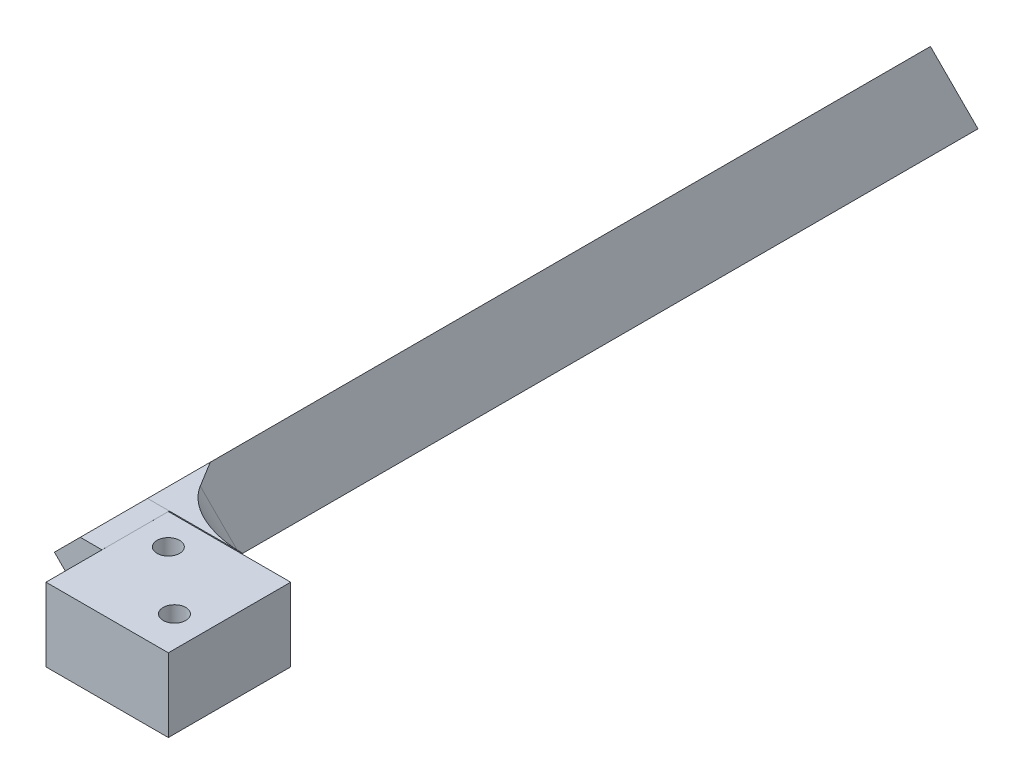
ISO-10303-21;
HEADER;
FILE_DESCRIPTION(('STEP AP214'),'2;1');
FILE_NAME('part.step','',(''),(''),'','','');
FILE_SCHEMA(('AUTOMOTIVE_DESIGN { 1 0 10303 214 1 1 1 1 }'));
ENDSEC;
DATA;
#1=APPLICATION_CONTEXT('core data for automotive mechanical design processes');
#2=APPLICATION_PROTOCOL_DEFINITION('international standard','automotive_design',2000,#1);
#3=PRODUCT_CONTEXT('',#1,'mechanical');
#4=PRODUCT('Part','Part','',(#3));
#5=PRODUCT_RELATED_PRODUCT_CATEGORY('part','',(#4));
#6=PRODUCT_DEFINITION_FORMATION('','',#4);
#7=PRODUCT_DEFINITION_CONTEXT('part definition',#1,'design');
#8=PRODUCT_DEFINITION('design','',#6,#7);
#9=PRODUCT_DEFINITION_SHAPE('','',#8);
#10=(LENGTH_UNIT() NAMED_UNIT(*) SI_UNIT(.MILLI.,.METRE.));
#11=(NAMED_UNIT(*) PLANE_ANGLE_UNIT() SI_UNIT($,.RADIAN.));
#12=(NAMED_UNIT(*) SI_UNIT($,.STERADIAN.) SOLID_ANGLE_UNIT());
#13=UNCERTAINTY_MEASURE_WITH_UNIT(LENGTH_MEASURE(1.E-05),#10,'distance_accuracy_value','');
#14=(GEOMETRIC_REPRESENTATION_CONTEXT(3) GLOBAL_UNCERTAINTY_ASSIGNED_CONTEXT((#13)) GLOBAL_UNIT_ASSIGNED_CONTEXT((#10,
#11,#12)) REPRESENTATION_CONTEXT('',''));
#15=CARTESIAN_POINT('',(0.,0.,0.));
#16=DIRECTION('',(0.,0.,1.));
#17=DIRECTION('',(1.,0.,0.));
#18=AXIS2_PLACEMENT_3D('',#15,#16,#17);
#19=CARTESIAN_POINT('',(-54.8596687094186,-214.742435052336,-20.1546564528659));
#20=DIRECTION('',(0.,0.,-1.));
#21=DIRECTION('',(1.,0.,0.));
#22=AXIS2_PLACEMENT_3D('',#19,#20,#21);
#23=PLANE('',#22);
#24=DIRECTION('',(-0.707106781186552,-0.707106781186543,0.));
#25=VECTOR('',#24,1.);
#26=CARTESIAN_POINT('',(-54.8596687094186,-214.742435052336,-20.1546564528659));
#27=LINE('',#26,#25);
#28=CARTESIAN_POINT('',(-50.6370361956894,-210.519802538606,-20.1546564528659));
#29=VERTEX_POINT('',#28);
#30=CARTESIAN_POINT('',(-50.6371361956895,-210.519902538606,-20.1546564528659));
#31=VERTEX_POINT('',#30);
#32=EDGE_CURVE('E194',#29,#31,#27,.T.);
#33=ORIENTED_EDGE('',*,*,#32,.T.);
#34=DIRECTION('',(1.,0.,0.));
#35=VECTOR('',#34,1.);
#36=CARTESIAN_POINT('',(-50.6371361956895,-210.519902538606,-20.1546564528659));
#37=LINE('',#36,#35);
#38=CARTESIAN_POINT('',(-47.0817870095854,-210.519902538607,-20.1546564528659));
#39=VERTEX_POINT('',#38);
#40=EDGE_CURVE('E203',#31,#39,#37,.T.);
#41=ORIENTED_EDGE('',*,*,#40,.T.);
#42=DIRECTION('',(0.,-1.,0.));
#43=VECTOR('',#42,1.);
#44=CARTESIAN_POINT('',(-47.0817870095854,-210.519902538607,-20.1546564528659));
#45=LINE('',#44,#43);
#46=CARTESIAN_POINT('',(-47.0817870095854,-222.520316752169,-20.1546564528659));
#47=VERTEX_POINT('',#46);
#48=EDGE_CURVE('E149',#39,#47,#45,.T.);
#49=ORIENTED_EDGE('',*,*,#48,.T.);
#50=DIRECTION('',(0.707106781186544,-0.707106781186551,0.));
#51=VECTOR('',#50,1.);
#52=CARTESIAN_POINT('',(-54.8596687094186,-214.742435052336,-20.1546564528659));
#53=LINE('',#52,#51);
#54=CARTESIAN_POINT('',(-47.0814941163666,-222.520609645388,-20.1546564528659));
#55=VERTEX_POINT('',#54);
#56=EDGE_CURVE('E59',#47,#55,#53,.T.);
#57=ORIENTED_EDGE('',*,*,#56,.T.);
#58=DIRECTION('',(-0.707106781186552,-0.707106781186543,0.));
#59=VECTOR('',#58,1.);
#60=CARTESIAN_POINT('',(-47.0814941163666,-222.520609645388,-20.1546564528659));
#61=LINE('',#60,#59);
#62=CARTESIAN_POINT('',(-35.0806870095853,-210.519802538607,-20.1546763952996));
#63=VERTEX_POINT('',#62);
#64=EDGE_CURVE('E53',#63,#55,#61,.T.);
#65=ORIENTED_EDGE('',*,*,#64,.F.);
#66=DIRECTION('',(-1.,0.,0.));
#67=VECTOR('',#66,1.);
#68=CARTESIAN_POINT('',(0.,-210.519802538607,-20.1546564528659));
#69=LINE('',#68,#67);
#70=EDGE_CURVE('E222',#63,#29,#69,.T.);
#71=ORIENTED_EDGE('',*,*,#70,.T.);
#72=EDGE_LOOP('',(#33,#41,#49,#57,#65,#71));
#73=FACE_BOUND('',#72,.T.);
#74=ADVANCED_FACE('F49',(#73),#23,.F.);
#75=CARTESIAN_POINT('',(-54.8596687094186,-214.742435052336,-14.1546564528659));
#76=DIRECTION('',(-0.707106781186551,-0.707106781186544,0.));
#77=DIRECTION('',(0.707106781186544,-0.707106781186551,0.));
#78=AXIS2_PLACEMENT_3D('',#75,#76,#77);
#79=PLANE('',#78);
#80=DIRECTION('',(0.,0.,-1.));
#81=VECTOR('',#80,1.);
#82=CARTESIAN_POINT('',(-47.0817870095854,-222.520316752169,-9.15465645286589));
#83=LINE('',#82,#81);
#84=CARTESIAN_POINT('',(-47.0817870095854,-222.520316752169,-14.1546564528658));
#85=VERTEX_POINT('',#84);
#86=EDGE_CURVE('E154',#85,#47,#83,.T.);
#87=ORIENTED_EDGE('',*,*,#86,.F.);
#88=DIRECTION('',(0.707106781186544,-0.707106781186551,0.));
#89=VECTOR('',#88,1.);
#90=CARTESIAN_POINT('',(-54.8596687094186,-214.742435052336,-14.1546564528659));
#91=LINE('',#90,#89);
#92=CARTESIAN_POINT('',(-47.0814941163666,-222.520609645388,-14.1546564528659));
#93=VERTEX_POINT('',#92);
#94=EDGE_CURVE('E136',#85,#93,#91,.T.);
#95=ORIENTED_EDGE('',*,*,#94,.T.);
#96=DIRECTION('',(0.,0.,1.));
#97=VECTOR('',#96,1.);
#98=CARTESIAN_POINT('',(-47.0814941163666,-222.520609645388,-14.1546564528659));
#99=LINE('',#98,#97);
#100=EDGE_CURVE('E138',#55,#93,#99,.T.);
#101=ORIENTED_EDGE('',*,*,#100,.F.);
#102=ORIENTED_EDGE('',*,*,#56,.F.);
#103=EDGE_LOOP('',(#87,#95,#101,#102));
#104=FACE_BOUND('',#103,.T.);
#105=ADVANCED_FACE('F152',(#104),#79,.F.);
#106=CARTESIAN_POINT('',(-49.3530746918805,-209.235841034798,-26.207658618796));
#107=DIRECTION('',(-0.64901526361989,-0.649015263619883,0.396936235656079));
#108=DIRECTION('',(0.707106781186544,-0.707106781186551,0.));
#109=AXIS2_PLACEMENT_3D('',#106,#107,#108);
#110=PLANE('',#109);
#111=DIRECTION('',(0.707106781186544,-0.707106781186551,0.));
#112=VECTOR('',#111,1.);
#113=CARTESIAN_POINT('',(-49.3530746918806,-209.235841034798,-26.207658618796));
#114=LINE('',#113,#112);
#115=CARTESIAN_POINT('',(-48.0691131880717,-210.519802538607,-26.207658618796));
#116=VERTEX_POINT('',#115);
#117=CARTESIAN_POINT('',(-41.5749000988286,-217.01401562785,-26.207658618796));
#118=VERTEX_POINT('',#117);
#119=EDGE_CURVE('E12',#116,#118,#114,.T.);
#120=ORIENTED_EDGE('',*,*,#119,.T.);
#121=DIRECTION('',(0.280676303931076,0.280676303931073,0.917846187998393));
#122=VECTOR('',#121,1.);
#123=CARTESIAN_POINT('',(-41.5749000988286,-217.01401562785,-26.207658618796));
#124=LINE('',#123,#122);
#125=CARTESIAN_POINT('',(-94.7203973163749,-270.159512845396,-200.));
#126=VERTEX_POINT('',#125);
#127=EDGE_CURVE('E103',#126,#118,#124,.T.);
#128=ORIENTED_EDGE('',*,*,#127,.F.);
#129=DIRECTION('',(0.707106781186544,-0.707106781186551,0.));
#130=VECTOR('',#129,1.);
#131=CARTESIAN_POINT('',(-102.498571909427,-262.381338252343,-200.));
#132=LINE('',#131,#130);
#133=CARTESIAN_POINT('',(-102.498571909427,-262.381338252343,-200.));
#134=VERTEX_POINT('',#133);
#135=EDGE_CURVE('E110',#134,#126,#132,.T.);
#136=ORIENTED_EDGE('',*,*,#135,.F.);
#137=DIRECTION('',(0.280676303931076,0.280676303931073,0.917846187998393));
#138=VECTOR('',#137,1.);
#139=CARTESIAN_POINT('',(-49.3530746918805,-209.235841034798,-26.207658618796));
#140=LINE('',#139,#138);
#141=CARTESIAN_POINT('',(-50.6370361956893,-210.519802538606,-30.4063713540794));
#142=VERTEX_POINT('',#141);
#143=EDGE_CURVE('E107',#134,#142,#140,.T.);
#144=ORIENTED_EDGE('',*,*,#143,.T.);
#145=DIRECTION('',(-0.521752205818372,0.,-0.853097084582794));
#146=VECTOR('',#145,1.);
#147=CARTESIAN_POINT('',(-48.4186400761628,-210.519802538607,-26.7791566707231));
#148=LINE('',#147,#146);
#149=EDGE_CURVE('E205',#116,#142,#148,.T.);
#150=ORIENTED_EDGE('',*,*,#149,.F.);
#151=EDGE_LOOP('',(#120,#128,#136,#144,#150));
#152=FACE_BOUND('',#151,.T.);
#153=ADVANCED_FACE('F51',(#152),#110,.F.);
#154=CARTESIAN_POINT('',(-42.8388534292472,-202.721619772164,-30.1917412916726));
#155=DIRECTION('',(0.707106781186544,-0.707106781186551,0.));
#156=DIRECTION('',(0.707106781186551,0.707106781186544,0.));
#157=AXIS2_PLACEMENT_3D('',#154,#155,#156);
#158=CYLINDRICAL_SURFACE('',#157,10.0370848388067);
#159=CARTESIAN_POINT('',(-35.0606788361953,-210.499794365216,-30.1917412916726));
#160=DIRECTION('',(-0.707106781186544,0.707106781186551,0.));
#161=DIRECTION('',(-0.707106781186551,-0.707106781186544,0.));
#162=AXIS2_PLACEMENT_3D('',#159,#160,#161);
#163=CIRCLE('',#162,10.0370848388067);
#164=EDGE_CURVE('E118',#118,#63,#163,.T.);
#165=ORIENTED_EDGE('',*,*,#164,.F.);
#166=ORIENTED_EDGE('',*,*,#119,.F.);
#167=CARTESIAN_POINT('',(-35.0406706628052,-210.519802538607,-30.1917412916726));
#168=DIRECTION('',(0.,1.,0.));
#169=DIRECTION('',(1.,0.,0.));
#170=AXIS2_PLACEMENT_3D('',#167,#168,#169);
#171=ELLIPSE('',#170,14.1945815057297,10.0370848388067);
#172=EDGE_CURVE('E213',#63,#116,#171,.F.);
#173=ORIENTED_EDGE('',*,*,#172,.F.);
#174=EDGE_LOOP('',(#165,#166,#173));
#175=FACE_BOUND('',#174,.T.);
#176=ADVANCED_FACE('F255',(#175),#158,.F.);
#177=CARTESIAN_POINT('',(-111.690960064852,-271.573726407769,-200.));
#178=DIRECTION('',(0.64901526361989,0.649015263619883,-0.396936235656079));
#179=DIRECTION('',(-0.707106781186544,0.707106781186551,0.));
#180=AXIS2_PLACEMENT_3D('',#177,#178,#179);
#181=PLANE('',#180);
#182=DIRECTION('',(-0.280676303931076,-0.280676303931073,-0.917846187998393));
#183=VECTOR('',#182,1.);
#184=CARTESIAN_POINT('',(-103.9127854718,-279.351901000821,-200.));
#185=LINE('',#184,#183);
#186=CARTESIAN_POINT('',(-103.9127854718,-279.351901000821,-200.));
#187=VERTEX_POINT('',#186);
#188=EDGE_CURVE('E105',#93,#187,#185,.T.);
#189=ORIENTED_EDGE('',*,*,#188,.F.);
#190=ORIENTED_EDGE('',*,*,#94,.F.);
#191=CARTESIAN_POINT('',(-54.8596687094186,-214.742435052336,-14.1546564528659));
#192=VERTEX_POINT('',#191);
#193=EDGE_CURVE('E133',#192,#85,#91,.T.);
#194=ORIENTED_EDGE('',*,*,#193,.F.);
#195=DIRECTION('',(-0.280676303931076,-0.280676303931073,-0.917846187998393));
#196=VECTOR('',#195,1.);
#197=CARTESIAN_POINT('',(-111.690960064852,-271.573726407769,-200.));
#198=LINE('',#197,#196);
#199=CARTESIAN_POINT('',(-111.690960064852,-271.573726407769,-200.));
#200=VERTEX_POINT('',#199);
#201=EDGE_CURVE('E192',#192,#200,#198,.T.);
#202=ORIENTED_EDGE('',*,*,#201,.T.);
#203=DIRECTION('',(0.707106781186544,-0.707106781186551,0.));
#204=VECTOR('',#203,1.);
#205=CARTESIAN_POINT('',(-111.690960064852,-271.573726407769,-200.));
#206=LINE('',#205,#204);
#207=EDGE_CURVE('E114',#200,#187,#206,.T.);
#208=ORIENTED_EDGE('',*,*,#207,.T.);
#209=EDGE_LOOP('',(#189,#190,#194,#202,#208));
#210=FACE_BOUND('',#209,.T.);
#211=ADVANCED_FACE('F191',(#210),#181,.F.);
#212=CARTESIAN_POINT('',(-102.498571909427,-262.381338252343,-200.));
#213=DIRECTION('',(0.,0.,1.));
#214=DIRECTION('',(-1.,0.,0.));
#215=AXIS2_PLACEMENT_3D('',#212,#213,#214);
#216=PLANE('',#215);
#217=DIRECTION('',(0.70710678118655,0.707106781186545,0.));
#218=VECTOR('',#217,1.);
#219=CARTESIAN_POINT('',(-94.7203973163749,-270.159512845396,-200.));
#220=LINE('',#219,#218);
#221=EDGE_CURVE('E98',#187,#126,#220,.T.);
#222=ORIENTED_EDGE('',*,*,#221,.F.);
#223=ORIENTED_EDGE('',*,*,#207,.F.);
#224=DIRECTION('',(0.70710678118655,0.707106781186545,0.));
#225=VECTOR('',#224,1.);
#226=CARTESIAN_POINT('',(-102.498571909427,-262.381338252343,-200.));
#227=LINE('',#226,#225);
#228=EDGE_CURVE('E76',#200,#134,#227,.T.);
#229=ORIENTED_EDGE('',*,*,#228,.T.);
#230=ORIENTED_EDGE('',*,*,#135,.T.);
#231=EDGE_LOOP('',(#222,#223,#229,#230));
#232=FACE_BOUND('',#231,.T.);
#233=ADVANCED_FACE('F111',(#232),#216,.F.);
#234=CARTESIAN_POINT('',(-42.8388534292472,-202.721619772164,-30.1917412916726));
#235=DIRECTION('',(-0.707106781186544,0.707106781186551,0.));
#236=DIRECTION('',(-0.707106781186551,-0.707106781186544,0.));
#237=AXIS2_PLACEMENT_3D('',#234,#235,#236);
#238=PLANE('',#237);
#239=DIRECTION('',(0.,0.,1.));
#240=VECTOR('',#239,1.);
#241=CARTESIAN_POINT('',(-50.6370361956893,-210.519802538606,-31.1546564528659));
#242=LINE('',#241,#240);
#243=EDGE_CURVE('E67',#142,#29,#242,.T.);
#244=ORIENTED_EDGE('',*,*,#243,.F.);
#245=ORIENTED_EDGE('',*,*,#143,.F.);
#246=ORIENTED_EDGE('',*,*,#228,.F.);
#247=ORIENTED_EDGE('',*,*,#201,.F.);
#248=DIRECTION('',(0.,0.,-1.));
#249=VECTOR('',#248,1.);
#250=CARTESIAN_POINT('',(-54.8596687094186,-214.742435052336,-9.15465645286589));
#251=LINE('',#250,#249);
#252=CARTESIAN_POINT('',(-54.8596687094186,-214.742435052336,-9.15465645286589));
#253=VERTEX_POINT('',#252);
#254=EDGE_CURVE('E187',#253,#192,#251,.T.);
#255=ORIENTED_EDGE('',*,*,#254,.F.);
#256=DIRECTION('',(0.707106781186548,0.707106781186547,0.));
#257=VECTOR('',#256,1.);
#258=CARTESIAN_POINT('',(-54.8596687094186,-214.742435052336,-9.15465645286589));
#259=LINE('',#258,#257);
#260=CARTESIAN_POINT('',(-50.6371361956895,-210.519902538606,-9.15465645286589));
#261=VERTEX_POINT('',#260);
#262=EDGE_CURVE('E202',#253,#261,#259,.T.);
#263=ORIENTED_EDGE('',*,*,#262,.T.);
#264=DIRECTION('',(0.,0.,-1.));
#265=VECTOR('',#264,1.);
#266=CARTESIAN_POINT('',(-50.6371361956895,-210.519902538606,-9.15465645286589));
#267=LINE('',#266,#265);
#268=EDGE_CURVE('E119',#261,#31,#267,.T.);
#269=ORIENTED_EDGE('',*,*,#268,.T.);
#270=ORIENTED_EDGE('',*,*,#32,.F.);
#271=EDGE_LOOP('',(#244,#245,#246,#247,#255,#263,#269,#270));
#272=FACE_BOUND('',#271,.T.);
#273=ADVANCED_FACE('F224',(#272),#238,.T.);
#274=CARTESIAN_POINT('',(-35.0606788361953,-210.499794365216,-30.1917412916726));
#275=DIRECTION('',(-0.707106781186544,0.707106781186551,0.));
#276=DIRECTION('',(-0.707106781186551,-0.707106781186544,0.));
#277=AXIS2_PLACEMENT_3D('',#274,#275,#276);
#278=PLANE('',#277);
#279=ORIENTED_EDGE('',*,*,#64,.T.);
#280=ORIENTED_EDGE('',*,*,#100,.T.);
#281=ORIENTED_EDGE('',*,*,#188,.T.);
#282=ORIENTED_EDGE('',*,*,#221,.T.);
#283=ORIENTED_EDGE('',*,*,#127,.T.);
#284=ORIENTED_EDGE('',*,*,#164,.T.);
#285=EDGE_LOOP('',(#279,#280,#281,#282,#283,#284));
#286=FACE_BOUND('',#285,.T.);
#287=ADVANCED_FACE('F100',(#286),#278,.F.);
#288=CARTESIAN_POINT('',(-47.0817870095854,-222.520316752169,-9.15465645286589));
#289=DIRECTION('',(0.707106781186546,0.707106781186549,0.));
#290=DIRECTION('',(-0.707106781186549,0.707106781186546,0.));
#291=AXIS2_PLACEMENT_3D('',#288,#289,#290);
#292=PLANE('',#291);
#293=CARTESIAN_POINT('',(-47.0817870095854,-222.520316752169,-9.15465645286589));
#294=VERTEX_POINT('',#293);
#295=EDGE_CURVE('E173',#294,#85,#83,.T.);
#296=ORIENTED_EDGE('',*,*,#295,.F.);
#297=DIRECTION('',(-0.707106781186549,0.707106781186546,0.));
#298=VECTOR('',#297,1.);
#299=CARTESIAN_POINT('',(-47.0817870095854,-222.520316752169,-9.15465645286589));
#300=LINE('',#299,#298);
#301=EDGE_CURVE('E200',#294,#253,#300,.T.);
#302=ORIENTED_EDGE('',*,*,#301,.T.);
#303=ORIENTED_EDGE('',*,*,#254,.T.);
#304=ORIENTED_EDGE('',*,*,#193,.T.);
#305=EDGE_LOOP('',(#296,#302,#303,#304));
#306=FACE_BOUND('',#305,.T.);
#307=ADVANCED_FACE('F185',(#306),#292,.F.);
#308=CARTESIAN_POINT('',(-50.6371361956895,-210.519902538606,-9.15465645286589));
#309=DIRECTION('',(0.,-1.,0.));
#310=DIRECTION('',(1.,0.,0.));
#311=AXIS2_PLACEMENT_3D('',#308,#309,#310);
#312=PLANE('',#311);
#313=ORIENTED_EDGE('',*,*,#40,.F.);
#314=ORIENTED_EDGE('',*,*,#268,.F.);
#315=DIRECTION('',(1.,0.,0.));
#316=VECTOR('',#315,1.);
#317=CARTESIAN_POINT('',(-50.6371361956895,-210.519902538606,-9.15465645286589));
#318=LINE('',#317,#316);
#319=CARTESIAN_POINT('',(-47.0817870095854,-210.519902538607,-9.15465645286589));
#320=VERTEX_POINT('',#319);
#321=EDGE_CURVE('E208',#261,#320,#318,.T.);
#322=ORIENTED_EDGE('',*,*,#321,.T.);
#323=DIRECTION('',(0.,0.,-1.));
#324=VECTOR('',#323,1.);
#325=CARTESIAN_POINT('',(-47.0817870095854,-210.519902538607,-9.15465645286589));
#326=LINE('',#325,#324);
#327=EDGE_CURVE('E122',#320,#39,#326,.T.);
#328=ORIENTED_EDGE('',*,*,#327,.T.);
#329=EDGE_LOOP('',(#313,#314,#322,#328));
#330=FACE_BOUND('',#329,.T.);
#331=ADVANCED_FACE('F231',(#330),#312,.F.);
#332=CARTESIAN_POINT('',(-47.0817870095854,-210.519902538607,-9.15465645286589));
#333=DIRECTION('',(-1.,0.,0.));
#334=DIRECTION('',(0.,0.,-1.));
#335=AXIS2_PLACEMENT_3D('',#332,#333,#334);
#336=PLANE('',#335);
#337=ORIENTED_EDGE('',*,*,#48,.F.);
#338=ORIENTED_EDGE('',*,*,#327,.F.);
#339=DIRECTION('',(0.,-1.,0.));
#340=VECTOR('',#339,1.);
#341=CARTESIAN_POINT('',(-47.0817870095854,-210.519902538607,-9.15465645286589));
#342=LINE('',#341,#340);
#343=EDGE_CURVE('E178',#320,#294,#342,.T.);
#344=ORIENTED_EDGE('',*,*,#343,.T.);
#345=ORIENTED_EDGE('',*,*,#295,.T.);
#346=ORIENTED_EDGE('',*,*,#86,.T.);
#347=EDGE_LOOP('',(#337,#338,#344,#345,#346));
#348=FACE_BOUND('',#347,.T.);
#349=ADVANCED_FACE('F174',(#348),#336,.F.);
#350=CARTESIAN_POINT('',(0.,0.,-9.15465645286589));
#351=DIRECTION('',(0.,0.,-1.));
#352=DIRECTION('',(1.,0.,0.));
#353=AXIS2_PLACEMENT_3D('',#350,#351,#352);
#354=PLANE('',#353);
#355=ORIENTED_EDGE('',*,*,#262,.F.);
#356=ORIENTED_EDGE('',*,*,#301,.F.);
#357=ORIENTED_EDGE('',*,*,#343,.F.);
#358=ORIENTED_EDGE('',*,*,#321,.F.);
#359=EDGE_LOOP('',(#355,#356,#357,#358));
#360=FACE_BOUND('',#359,.T.);
#361=ADVANCED_FACE('F237',(#360),#354,.F.);
#362=CARTESIAN_POINT('',(0.,-210.519802538607,-31.1546564528659));
#363=DIRECTION('',(0.,-1.,0.));
#364=DIRECTION('',(0.,0.,1.));
#365=AXIS2_PLACEMENT_3D('',#362,#363,#364);
#366=PLANE('',#365);
#367=ORIENTED_EDGE('',*,*,#172,.T.);
#368=ORIENTED_EDGE('',*,*,#149,.T.);
#369=ORIENTED_EDGE('',*,*,#243,.T.);
#370=ORIENTED_EDGE('',*,*,#70,.F.);
#371=EDGE_LOOP('',(#367,#368,#369,#370));
#372=FACE_BOUND('',#371,.T.);
#373=ADVANCED_FACE('F239',(#372),#366,.F.);
#374=CLOSED_SHELL('',(#74,#105,#153,#176,#211,#233,#273,#287,#307,#331,#349,#361,#373));
#375=MANIFOLD_SOLID_BREP('B2',#374);
#376=CARTESIAN_POINT('',(-47.0807870095854,-210.519902538607,-20.));
#377=DIRECTION('',(1.,0.,0.));
#378=DIRECTION('',(0.,0.,1.));
#379=AXIS2_PLACEMENT_3D('',#376,#377,#378);
#380=PLANE('',#379);
#381=CARTESIAN_POINT('',(-47.0807870095854,-216.708306212354,-3.71895693201907));
#382=DIRECTION('',(1.,0.,0.));
#383=DIRECTION('',(0.,0.,-1.));
#384=AXIS2_PLACEMENT_3D('',#381,#382,#383);
#385=CIRCLE('',#384,1.38884616299363);
#386=CARTESIAN_POINT('',(-47.0807870095854,-216.708306212354,-5.1078030950127));
#387=VERTEX_POINT('',#386);
#388=EDGE_CURVE('E440',#387,#387,#385,.T.);
#389=ORIENTED_EDGE('',*,*,#388,.T.);
#390=EDGE_LOOP('',(#389));
#391=FACE_BOUND('',#390,.T.);
#392=DIRECTION('',(0.,-1.,0.));
#393=VECTOR('',#392,1.);
#394=CARTESIAN_POINT('',(-47.0807870095854,-210.519902538607,0.));
#395=LINE('',#394,#393);
#396=CARTESIAN_POINT('',(-47.0807870095854,-210.519902538607,0.));
#397=VERTEX_POINT('',#396);
#398=CARTESIAN_POINT('',(-47.0807870095854,-222.519902538607,0.));
#399=VERTEX_POINT('',#398);
#400=EDGE_CURVE('E419',#397,#399,#395,.T.);
#401=ORIENTED_EDGE('',*,*,#400,.F.);
#402=DIRECTION('',(0.,0.,1.));
#403=VECTOR('',#402,1.);
#404=CARTESIAN_POINT('',(-47.0807870095854,-210.519902538607,-20.));
#405=LINE('',#404,#403);
#406=CARTESIAN_POINT('',(-47.0807870095854,-210.519902538607,-20.));
#407=VERTEX_POINT('',#406);
#408=EDGE_CURVE('E418',#407,#397,#405,.T.);
#409=ORIENTED_EDGE('',*,*,#408,.F.);
#410=DIRECTION('',(0.,-1.,0.));
#411=VECTOR('',#410,1.);
#412=CARTESIAN_POINT('',(-47.0807870095854,-210.519902538607,-20.));
#413=LINE('',#412,#411);
#414=CARTESIAN_POINT('',(-47.0807870095854,-222.519902538607,-20.));
#415=VERTEX_POINT('',#414);
#416=EDGE_CURVE('E412',#407,#415,#413,.T.);
#417=ORIENTED_EDGE('',*,*,#416,.T.);
#418=DIRECTION('',(0.,0.,1.));
#419=VECTOR('',#418,1.);
#420=CARTESIAN_POINT('',(-47.0807870095854,-222.519902538607,-20.));
#421=LINE('',#420,#419);
#422=EDGE_CURVE('E47',#415,#399,#421,.T.);
#423=ORIENTED_EDGE('',*,*,#422,.T.);
#424=EDGE_LOOP('',(#401,#409,#417,#423));
#425=FACE_BOUND('',#424,.T.);
#426=ADVANCED_FACE('F352',(#391,#425),#380,.F.);
#427=CARTESIAN_POINT('',(-47.0807870095854,-222.519902538607,-20.));
#428=DIRECTION('',(0.,1.,0.));
#429=DIRECTION('',(0.,0.,-1.));
#430=AXIS2_PLACEMENT_3D('',#427,#428,#429);
#431=PLANE('',#430);
#432=CARTESIAN_POINT('',(-42.0807870095854,-222.519902538607,-15.));
#433=DIRECTION('',(0.,1.,0.));
#434=DIRECTION('',(0.,0.,1.));
#435=AXIS2_PLACEMENT_3D('',#432,#433,#434);
#436=CIRCLE('',#435,1.85);
#437=CARTESIAN_POINT('',(-42.0807870095854,-222.519902538607,-13.15));
#438=VERTEX_POINT('',#437);
#439=EDGE_CURVE('E428',#438,#438,#436,.T.);
#440=ORIENTED_EDGE('',*,*,#439,.T.);
#441=EDGE_LOOP('',(#440));
#442=FACE_BOUND('',#441,.T.);
#443=CARTESIAN_POINT('',(-32.0807870095854,-222.519902538607,-6.00000000000001));
#444=DIRECTION('',(0.,1.,0.));
#445=DIRECTION('',(0.,0.,1.));
#446=AXIS2_PLACEMENT_3D('',#443,#444,#445);
#447=CIRCLE('',#446,1.85);
#448=CARTESIAN_POINT('',(-32.0807870095854,-222.519902538607,-4.15000000000001));
#449=VERTEX_POINT('',#448);
#450=EDGE_CURVE('E433',#449,#449,#447,.T.);
#451=ORIENTED_EDGE('',*,*,#450,.T.);
#452=EDGE_LOOP('',(#451));
#453=FACE_BOUND('',#452,.T.);
#454=DIRECTION('',(1.,0.,0.));
#455=VECTOR('',#454,1.);
#456=CARTESIAN_POINT('',(-47.0807870095854,-222.519902538607,0.));
#457=LINE('',#456,#455);
#458=CARTESIAN_POINT('',(-27.0807870095854,-222.519902538607,0.));
#459=VERTEX_POINT('',#458);
#460=EDGE_CURVE('E421',#399,#459,#457,.T.);
#461=ORIENTED_EDGE('',*,*,#460,.F.);
#462=ORIENTED_EDGE('',*,*,#422,.F.);
#463=DIRECTION('',(1.,0.,0.));
#464=VECTOR('',#463,1.);
#465=CARTESIAN_POINT('',(-47.0807870095854,-222.519902538607,-20.));
#466=LINE('',#465,#464);
#467=CARTESIAN_POINT('',(-27.0807870095854,-222.519902538607,-20.));
#468=VERTEX_POINT('',#467);
#469=EDGE_CURVE('E395',#415,#468,#466,.T.);
#470=ORIENTED_EDGE('',*,*,#469,.T.);
#471=DIRECTION('',(0.,0.,1.));
#472=VECTOR('',#471,1.);
#473=CARTESIAN_POINT('',(-27.0807870095854,-222.519902538607,-20.));
#474=LINE('',#473,#472);
#475=EDGE_CURVE('E361',#468,#459,#474,.T.);
#476=ORIENTED_EDGE('',*,*,#475,.T.);
#477=EDGE_LOOP('',(#461,#462,#470,#476));
#478=FACE_BOUND('',#477,.T.);
#479=ADVANCED_FACE('F410',(#442,#453,#478),#431,.F.);
#480=CARTESIAN_POINT('',(-27.0807870095854,-210.519902538607,-20.));
#481=DIRECTION('',(-1.,0.,0.));
#482=DIRECTION('',(0.,0.,-1.));
#483=AXIS2_PLACEMENT_3D('',#480,#481,#482);
#484=PLANE('',#483);
#485=DIRECTION('',(0.,1.,0.));
#486=VECTOR('',#485,1.);
#487=CARTESIAN_POINT('',(-27.0807870095854,-210.519902538607,0.));
#488=LINE('',#487,#486);
#489=CARTESIAN_POINT('',(-27.0807870095854,-210.519902538607,0.));
#490=VERTEX_POINT('',#489);
#491=EDGE_CURVE('E405',#459,#490,#488,.T.);
#492=ORIENTED_EDGE('',*,*,#491,.F.);
#493=ORIENTED_EDGE('',*,*,#475,.F.);
#494=DIRECTION('',(0.,1.,0.));
#495=VECTOR('',#494,1.);
#496=CARTESIAN_POINT('',(-27.0807870095854,-210.519902538607,-20.));
#497=LINE('',#496,#495);
#498=CARTESIAN_POINT('',(-27.0807870095854,-210.519902538607,-20.));
#499=VERTEX_POINT('',#498);
#500=EDGE_CURVE('E398',#468,#499,#497,.T.);
#501=ORIENTED_EDGE('',*,*,#500,.T.);
#502=DIRECTION('',(0.,0.,1.));
#503=VECTOR('',#502,1.);
#504=CARTESIAN_POINT('',(-27.0807870095854,-210.519902538607,-20.));
#505=LINE('',#504,#503);
#506=EDGE_CURVE('E408',#499,#490,#505,.T.);
#507=ORIENTED_EDGE('',*,*,#506,.T.);
#508=EDGE_LOOP('',(#492,#493,#501,#507));
#509=FACE_BOUND('',#508,.T.);
#510=ADVANCED_FACE('F404',(#509),#484,.F.);
#511=CARTESIAN_POINT('',(-47.0807870095854,-210.519902538607,-20.));
#512=DIRECTION('',(0.,-1.,0.));
#513=DIRECTION('',(0.,0.,1.));
#514=AXIS2_PLACEMENT_3D('',#511,#512,#513);
#515=PLANE('',#514);
#516=CARTESIAN_POINT('',(-42.0807870095854,-210.519902538607,-15.));
#517=DIRECTION('',(0.,1.,0.));
#518=DIRECTION('',(0.,0.,1.));
#519=AXIS2_PLACEMENT_3D('',#516,#517,#518);
#520=CIRCLE('',#519,1.85);
#521=CARTESIAN_POINT('',(-42.0807870095854,-210.519902538607,-13.15));
#522=VERTEX_POINT('',#521);
#523=EDGE_CURVE('E355',#522,#522,#520,.T.);
#524=ORIENTED_EDGE('',*,*,#523,.F.);
#525=EDGE_LOOP('',(#524));
#526=FACE_BOUND('',#525,.T.);
#527=CARTESIAN_POINT('',(-32.0807870095854,-210.519902538607,-6.00000000000001));
#528=DIRECTION('',(0.,1.,0.));
#529=DIRECTION('',(0.,0.,1.));
#530=AXIS2_PLACEMENT_3D('',#527,#528,#529);
#531=CIRCLE('',#530,1.85);
#532=CARTESIAN_POINT('',(-32.0807870095854,-210.519902538607,-4.15000000000001));
#533=VERTEX_POINT('',#532);
#534=EDGE_CURVE('E426',#533,#533,#531,.T.);
#535=ORIENTED_EDGE('',*,*,#534,.F.);
#536=EDGE_LOOP('',(#535));
#537=FACE_BOUND('',#536,.T.);
#538=DIRECTION('',(-1.,0.,0.));
#539=VECTOR('',#538,1.);
#540=CARTESIAN_POINT('',(-47.0807870095854,-210.519902538607,0.));
#541=LINE('',#540,#539);
#542=EDGE_CURVE('E384',#490,#397,#541,.T.);
#543=ORIENTED_EDGE('',*,*,#542,.F.);
#544=ORIENTED_EDGE('',*,*,#506,.F.);
#545=DIRECTION('',(-1.,0.,0.));
#546=VECTOR('',#545,1.);
#547=CARTESIAN_POINT('',(-47.0807870095854,-210.519902538607,-20.));
#548=LINE('',#547,#546);
#549=EDGE_CURVE('E370',#499,#407,#548,.T.);
#550=ORIENTED_EDGE('',*,*,#549,.T.);
#551=ORIENTED_EDGE('',*,*,#408,.T.);
#552=EDGE_LOOP('',(#543,#544,#550,#551));
#553=FACE_BOUND('',#552,.T.);
#554=ADVANCED_FACE('F476',(#526,#537,#553),#515,.F.);
#555=CARTESIAN_POINT('',(0.,0.,-20.));
#556=DIRECTION('',(0.,0.,-1.));
#557=DIRECTION('',(1.,0.,0.));
#558=AXIS2_PLACEMENT_3D('',#555,#556,#557);
#559=PLANE('',#558);
#560=ORIENTED_EDGE('',*,*,#416,.F.);
#561=ORIENTED_EDGE('',*,*,#549,.F.);
#562=ORIENTED_EDGE('',*,*,#500,.F.);
#563=ORIENTED_EDGE('',*,*,#469,.F.);
#564=EDGE_LOOP('',(#560,#561,#562,#563));
#565=FACE_BOUND('',#564,.T.);
#566=ADVANCED_FACE('F400',(#565),#559,.T.);
#567=CARTESIAN_POINT('',(0.,0.,0.));
#568=DIRECTION('',(0.,0.,-1.));
#569=DIRECTION('',(1.,0.,0.));
#570=AXIS2_PLACEMENT_3D('',#567,#568,#569);
#571=PLANE('',#570);
#572=ORIENTED_EDGE('',*,*,#400,.T.);
#573=ORIENTED_EDGE('',*,*,#460,.T.);
#574=ORIENTED_EDGE('',*,*,#491,.T.);
#575=ORIENTED_EDGE('',*,*,#542,.T.);
#576=EDGE_LOOP('',(#572,#573,#574,#575));
#577=FACE_BOUND('',#576,.T.);
#578=ADVANCED_FACE('F466',(#577),#571,.F.);
#579=CARTESIAN_POINT('',(-32.0807870095854,-202.519902538607,-6.00000000000001));
#580=DIRECTION('',(0.,-1.,0.));
#581=DIRECTION('',(0.,0.,1.));
#582=AXIS2_PLACEMENT_3D('',#579,#580,#581);
#583=CYLINDRICAL_SURFACE('',#582,1.85);
#584=ORIENTED_EDGE('',*,*,#450,.F.);
#585=EDGE_LOOP('',(#584));
#586=FACE_BOUND('',#585,.T.);
#587=ORIENTED_EDGE('',*,*,#534,.T.);
#588=EDGE_LOOP('',(#587));
#589=FACE_BOUND('',#588,.T.);
#590=ADVANCED_FACE('F468',(#586,#589),#583,.F.);
#591=CARTESIAN_POINT('',(-42.0807870095854,-202.519902538607,-15.));
#592=DIRECTION('',(0.,-1.,0.));
#593=DIRECTION('',(0.,0.,1.));
#594=AXIS2_PLACEMENT_3D('',#591,#592,#593);
#595=CYLINDRICAL_SURFACE('',#594,1.85);
#596=ORIENTED_EDGE('',*,*,#439,.F.);
#597=EDGE_LOOP('',(#596));
#598=FACE_BOUND('',#597,.T.);
#599=ORIENTED_EDGE('',*,*,#523,.T.);
#600=EDGE_LOOP('',(#599));
#601=FACE_BOUND('',#600,.T.);
#602=ADVANCED_FACE('F455',(#598,#601),#595,.F.);
#603=CARTESIAN_POINT('',(-46.0807870095854,-216.708306212354,-3.71895693201907));
#604=DIRECTION('',(-1.,0.,0.));
#605=DIRECTION('',(0.,0.,-1.));
#606=AXIS2_PLACEMENT_3D('',#603,#604,#605);
#607=CYLINDRICAL_SURFACE('',#606,1.38884616299363);
#608=CARTESIAN_POINT('',(-46.0807870095854,-216.708306212354,-3.71895693201907));
#609=DIRECTION('',(1.,0.,0.));
#610=DIRECTION('',(0.,0.,-1.));
#611=AXIS2_PLACEMENT_3D('',#608,#609,#610);
#612=CIRCLE('',#611,1.38884616299363);
#613=CARTESIAN_POINT('',(-46.0807870095854,-216.708306212354,-5.1078030950127));
#614=VERTEX_POINT('',#613);
#615=EDGE_CURVE('E438',#614,#614,#612,.T.);
#616=ORIENTED_EDGE('',*,*,#615,.T.);
#617=EDGE_LOOP('',(#616));
#618=FACE_BOUND('',#617,.T.);
#619=ORIENTED_EDGE('',*,*,#388,.F.);
#620=EDGE_LOOP('',(#619));
#621=FACE_BOUND('',#620,.T.);
#622=ADVANCED_FACE('F446',(#618,#621),#607,.F.);
#623=CARTESIAN_POINT('',(-46.0807870095854,-216.708306212354,-3.71895693201907));
#624=DIRECTION('',(-1.,0.,0.));
#625=DIRECTION('',(0.,0.,-1.));
#626=AXIS2_PLACEMENT_3D('',#623,#624,#625);
#627=PLANE('',#626);
#628=ORIENTED_EDGE('',*,*,#615,.F.);
#629=EDGE_LOOP('',(#628));
#630=FACE_BOUND('',#629,.T.);
#631=ADVANCED_FACE('F449',(#630),#627,.T.);
#632=CLOSED_SHELL('',(#426,#479,#510,#554,#566,#578,#590,#602,#622,#631));
#633=MANIFOLD_SOLID_BREP('B6',#632);
#634=ADVANCED_BREP_SHAPE_REPRESENTATION('',(#18,#375,#633),#14);
#635=SHAPE_DEFINITION_REPRESENTATION(#9,#634);
ENDSEC;
END-ISO-10303-21;
